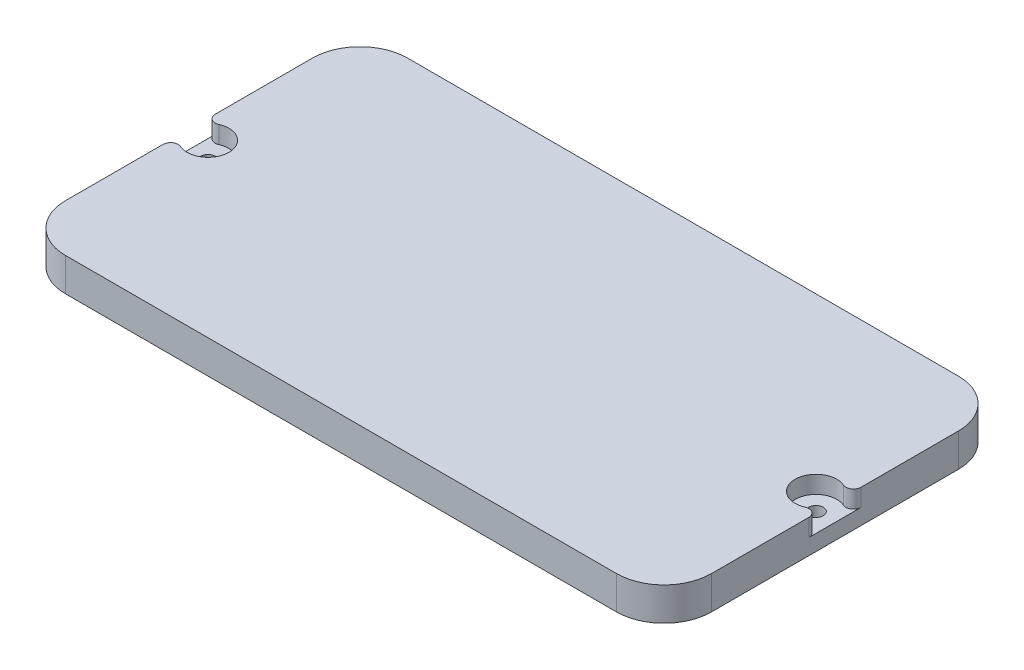
ISO-10303-21;
HEADER;
FILE_DESCRIPTION(('STEP AP214'),'2;1');
FILE_NAME('part.step','',(''),(''),'','','');
FILE_SCHEMA(('AUTOMOTIVE_DESIGN { 1 0 10303 214 1 1 1 1 }'));
ENDSEC;
DATA;
#1=APPLICATION_CONTEXT('core data for automotive mechanical design processes');
#2=APPLICATION_PROTOCOL_DEFINITION('international standard','automotive_design',2000,#1);
#3=PRODUCT_CONTEXT('',#1,'mechanical');
#4=PRODUCT('Part','Part','',(#3));
#5=PRODUCT_RELATED_PRODUCT_CATEGORY('part','',(#4));
#6=PRODUCT_DEFINITION_FORMATION('','',#4);
#7=PRODUCT_DEFINITION_CONTEXT('part definition',#1,'design');
#8=PRODUCT_DEFINITION('design','',#6,#7);
#9=PRODUCT_DEFINITION_SHAPE('','',#8);
#10=(LENGTH_UNIT() NAMED_UNIT(*) SI_UNIT(.MILLI.,.METRE.));
#11=(NAMED_UNIT(*) PLANE_ANGLE_UNIT() SI_UNIT($,.RADIAN.));
#12=(NAMED_UNIT(*) SI_UNIT($,.STERADIAN.) SOLID_ANGLE_UNIT());
#13=UNCERTAINTY_MEASURE_WITH_UNIT(LENGTH_MEASURE(1.E-05),#10,'distance_accuracy_value','');
#14=(GEOMETRIC_REPRESENTATION_CONTEXT(3) GLOBAL_UNCERTAINTY_ASSIGNED_CONTEXT((#13)) GLOBAL_UNIT_ASSIGNED_CONTEXT((#10,
#11,#12)) REPRESENTATION_CONTEXT('',''));
#15=CARTESIAN_POINT('',(0.,0.,0.));
#16=DIRECTION('',(0.,0.,1.));
#17=DIRECTION('',(1.,0.,0.));
#18=AXIS2_PLACEMENT_3D('',#15,#16,#17);
#19=CARTESIAN_POINT('',(1191.18804351422,1662.78438415699,0.));
#20=DIRECTION('',(0.,1.,0.));
#21=DIRECTION('',(0.,0.,1.));
#22=AXIS2_PLACEMENT_3D('',#19,#20,#21);
#23=CYLINDRICAL_SURFACE('',#22,2.4512763115585);
#24=CARTESIAN_POINT('',(1191.18804351422,1662.78438415699,0.));
#25=DIRECTION('',(0.,1.,0.));
#26=DIRECTION('',(0.,0.,1.));
#27=AXIS2_PLACEMENT_3D('',#24,#25,#26);
#28=CIRCLE('',#27,2.4512763115585);
#29=CARTESIAN_POINT('',(1191.18804351422,1662.78438415699,2.4512763115585));
#30=VERTEX_POINT('',#29);
#31=EDGE_CURVE('E205',#30,#30,#28,.F.);
#32=ORIENTED_EDGE('',*,*,#31,.T.);
#33=EDGE_LOOP('',(#32));
#34=FACE_BOUND('',#33,.T.);
#35=CARTESIAN_POINT('',(1191.18804351422,1668.05488415699,0.));
#36=DIRECTION('',(0.,1.,0.));
#37=DIRECTION('',(0.,0.,1.));
#38=AXIS2_PLACEMENT_3D('',#35,#36,#37);
#39=CIRCLE('',#38,2.4512763115585);
#40=CARTESIAN_POINT('',(1191.18804351422,1668.05488415699,2.45127631155851));
#41=VERTEX_POINT('',#40);
#42=EDGE_CURVE('E314',#41,#41,#39,.T.);
#43=ORIENTED_EDGE('',*,*,#42,.T.);
#44=EDGE_LOOP('',(#43));
#45=FACE_BOUND('',#44,.T.);
#46=ADVANCED_FACE('F33',(#34,#45),#23,.F.);
#47=CARTESIAN_POINT('',(1394.38804351422,1662.78438415699,-2.70566684940159E-13));
#48=DIRECTION('',(0.,1.,0.));
#49=DIRECTION('',(0.,0.,1.));
#50=AXIS2_PLACEMENT_3D('',#47,#48,#49);
#51=CYLINDRICAL_SURFACE('',#50,2.4512763115585);
#52=CARTESIAN_POINT('',(1394.38804351422,1662.78438415699,-2.70566684940159E-13));
#53=DIRECTION('',(0.,1.,0.));
#54=DIRECTION('',(0.,0.,1.));
#55=AXIS2_PLACEMENT_3D('',#52,#53,#54);
#56=CIRCLE('',#55,2.4512763115585);
#57=CARTESIAN_POINT('',(1394.38804351422,1662.78438415699,2.45127631155823));
#58=VERTEX_POINT('',#57);
#59=EDGE_CURVE('E202',#58,#58,#56,.F.);
#60=ORIENTED_EDGE('',*,*,#59,.T.);
#61=EDGE_LOOP('',(#60));
#62=FACE_BOUND('',#61,.T.);
#63=CARTESIAN_POINT('',(1394.38804351422,1668.05488415699,-2.64715254488873E-13));
#64=DIRECTION('',(0.,1.,0.));
#65=DIRECTION('',(0.,0.,1.));
#66=AXIS2_PLACEMENT_3D('',#63,#64,#65);
#67=CIRCLE('',#66,2.4512763115585);
#68=CARTESIAN_POINT('',(1394.38804351422,1668.05488415699,2.45127631155824));
#69=VERTEX_POINT('',#68);
#70=EDGE_CURVE('E208',#69,#69,#67,.T.);
#71=ORIENTED_EDGE('',*,*,#70,.T.);
#72=EDGE_LOOP('',(#71));
#73=FACE_BOUND('',#72,.T.);
#74=ADVANCED_FACE('F342',(#62,#73),#51,.F.);
#75=CARTESIAN_POINT('',(1292.78804351422,1662.78438415699,-4.51194637207664E-13));
#76=DIRECTION('',(0.,1.,0.));
#77=DIRECTION('',(0.,0.,1.));
#78=AXIS2_PLACEMENT_3D('',#75,#76,#77);
#79=PLANE('',#78);
#80=CARTESIAN_POINT('',(1200.71304351422,1662.78438415699,-41.2750000000003));
#81=DIRECTION('',(0.,1.,0.));
#82=DIRECTION('',(0.,0.,1.));
#83=AXIS2_PLACEMENT_3D('',#80,#81,#82);
#84=CIRCLE('',#83,15.875);
#85=CARTESIAN_POINT('',(1200.71304351422,1662.78438415699,-57.1500000000003));
#86=VERTEX_POINT('',#85);
#87=CARTESIAN_POINT('',(1184.83804351422,1662.78438415699,-41.2750000000003));
#88=VERTEX_POINT('',#87);
#89=EDGE_CURVE('E199',#86,#88,#84,.T.);
#90=ORIENTED_EDGE('',*,*,#89,.F.);
#91=DIRECTION('',(-1.,0.,0.));
#92=VECTOR('',#91,1.);
#93=CARTESIAN_POINT('',(1200.71304351422,1662.78438415699,-57.1500000000003));
#94=LINE('',#93,#92);
#95=CARTESIAN_POINT('',(1384.86304351422,1662.78438415699,-57.1500000000007));
#96=VERTEX_POINT('',#95);
#97=EDGE_CURVE('E278',#96,#86,#94,.T.);
#98=ORIENTED_EDGE('',*,*,#97,.F.);
#99=CARTESIAN_POINT('',(1384.86304351422,1662.78438415699,-41.2750000000005));
#100=DIRECTION('',(0.,1.,0.));
#101=DIRECTION('',(0.,0.,1.));
#102=AXIS2_PLACEMENT_3D('',#99,#100,#101);
#103=CIRCLE('',#102,15.8750000000001);
#104=CARTESIAN_POINT('',(1400.73804351422,1662.78438415699,-41.2750000000005));
#105=VERTEX_POINT('',#104);
#106=EDGE_CURVE('E163',#105,#96,#103,.T.);
#107=ORIENTED_EDGE('',*,*,#106,.F.);
#108=DIRECTION('',(0.,0.,-1.));
#109=VECTOR('',#108,1.);
#110=CARTESIAN_POINT('',(1400.73804351422,1662.78438415699,-41.2750000000005));
#111=LINE('',#110,#109);
#112=CARTESIAN_POINT('',(1400.73804351422,1662.78438415699,41.2749999999994));
#113=VERTEX_POINT('',#112);
#114=EDGE_CURVE('E160',#113,#105,#111,.T.);
#115=ORIENTED_EDGE('',*,*,#114,.F.);
#116=CARTESIAN_POINT('',(1384.86304351422,1662.78438415699,41.2749999999995));
#117=DIRECTION('',(0.,1.,0.));
#118=DIRECTION('',(0.,0.,1.));
#119=AXIS2_PLACEMENT_3D('',#116,#117,#118);
#120=CIRCLE('',#119,15.8750000000001);
#121=CARTESIAN_POINT('',(1384.86304351422,1662.78438415699,57.1499999999996));
#122=VERTEX_POINT('',#121);
#123=EDGE_CURVE('E191',#122,#113,#120,.T.);
#124=ORIENTED_EDGE('',*,*,#123,.F.);
#125=DIRECTION('',(1.,0.,0.));
#126=VECTOR('',#125,1.);
#127=CARTESIAN_POINT('',(1384.86304351422,1662.78438415699,57.1499999999996));
#128=LINE('',#127,#126);
#129=CARTESIAN_POINT('',(1200.71304351422,1662.78438415699,57.1499999999996));
#130=VERTEX_POINT('',#129);
#131=EDGE_CURVE('E271',#130,#122,#128,.T.);
#132=ORIENTED_EDGE('',*,*,#131,.F.);
#133=CARTESIAN_POINT('',(1200.71304351422,1662.78438415699,41.2749999999997));
#134=DIRECTION('',(0.,1.,0.));
#135=DIRECTION('',(0.,0.,1.));
#136=AXIS2_PLACEMENT_3D('',#133,#134,#135);
#137=CIRCLE('',#136,15.875);
#138=CARTESIAN_POINT('',(1184.83804351422,1662.78438415699,41.2749999999997));
#139=VERTEX_POINT('',#138);
#140=EDGE_CURVE('E195',#139,#130,#137,.T.);
#141=ORIENTED_EDGE('',*,*,#140,.F.);
#142=DIRECTION('',(0.,0.,1.));
#143=VECTOR('',#142,1.);
#144=CARTESIAN_POINT('',(1184.83804351422,1662.78438415699,41.2749999999997));
#145=LINE('',#144,#143);
#146=EDGE_CURVE('E176',#88,#139,#145,.T.);
#147=ORIENTED_EDGE('',*,*,#146,.F.);
#148=EDGE_LOOP('',(#90,#98,#107,#115,#124,#132,#141,#147));
#149=FACE_BOUND('',#148,.T.);
#150=ORIENTED_EDGE('',*,*,#59,.F.);
#151=EDGE_LOOP('',(#150));
#152=FACE_BOUND('',#151,.T.);
#153=ORIENTED_EDGE('',*,*,#31,.F.);
#154=EDGE_LOOP('',(#153));
#155=FACE_BOUND('',#154,.T.);
#156=ADVANCED_FACE('F285',(#149,#152,#155),#79,.F.);
#157=CARTESIAN_POINT('',(1200.71304351422,1662.78438415699,-41.2750000000003));
#158=DIRECTION('',(0.,1.,0.));
#159=DIRECTION('',(0.,0.,1.));
#160=AXIS2_PLACEMENT_3D('',#157,#158,#159);
#161=CYLINDRICAL_SURFACE('',#160,15.875);
#162=ORIENTED_EDGE('',*,*,#89,.T.);
#163=DIRECTION('',(0.,1.,0.));
#164=VECTOR('',#163,1.);
#165=CARTESIAN_POINT('',(1184.83804351422,1662.78438415699,-41.2750000000004));
#166=LINE('',#165,#164);
#167=CARTESIAN_POINT('',(1184.83804351422,1673.89688415699,-41.2750000000004));
#168=VERTEX_POINT('',#167);
#169=EDGE_CURVE('E201',#168,#88,#166,.F.);
#170=ORIENTED_EDGE('',*,*,#169,.F.);
#171=CARTESIAN_POINT('',(1200.71304351422,1673.89688415699,-41.2750000000003));
#172=DIRECTION('',(0.,1.,0.));
#173=DIRECTION('',(0.,0.,1.));
#174=AXIS2_PLACEMENT_3D('',#171,#172,#173);
#175=CIRCLE('',#174,15.875);
#176=CARTESIAN_POINT('',(1200.71304351422,1673.89688415699,-57.1500000000005));
#177=VERTEX_POINT('',#176);
#178=EDGE_CURVE('E185',#177,#168,#175,.T.);
#179=ORIENTED_EDGE('',*,*,#178,.F.);
#180=DIRECTION('',(0.,1.,0.));
#181=VECTOR('',#180,1.);
#182=CARTESIAN_POINT('',(1200.71304351422,1662.78438415699,-57.1500000000003));
#183=LINE('',#182,#181);
#184=EDGE_CURVE('E189',#86,#177,#183,.T.);
#185=ORIENTED_EDGE('',*,*,#184,.F.);
#186=EDGE_LOOP('',(#162,#170,#179,#185));
#187=FACE_BOUND('',#186,.T.);
#188=ADVANCED_FACE('F300',(#187),#161,.T.);
#189=CARTESIAN_POINT('',(1184.83804351422,1662.78438415699,41.2749999999997));
#190=DIRECTION('',(-1.,0.,0.));
#191=DIRECTION('',(0.,0.,1.));
#192=AXIS2_PLACEMENT_3D('',#189,#190,#191);
#193=PLANE('',#192);
#194=DIRECTION('',(0.,0.,1.));
#195=VECTOR('',#194,1.);
#196=CARTESIAN_POINT('',(1184.83804351422,1673.89688415699,-4.51194637207664E-13));
#197=LINE('',#196,#195);
#198=CARTESIAN_POINT('',(1184.83804351422,1673.89688415699,8.72980669889081));
#199=VERTEX_POINT('',#198);
#200=CARTESIAN_POINT('',(1184.83804351422,1673.89688415699,41.2749999999997));
#201=VERTEX_POINT('',#200);
#202=EDGE_CURVE('E188',#199,#201,#197,.T.);
#203=ORIENTED_EDGE('',*,*,#202,.F.);
#204=DIRECTION('',(0.,-1.,0.));
#205=VECTOR('',#204,1.);
#206=CARTESIAN_POINT('',(1184.83804351422,1668.05488415699,8.72980669889081));
#207=LINE('',#206,#205);
#208=CARTESIAN_POINT('',(1184.83804351422,1668.05488415699,8.72980669889081));
#209=VERTEX_POINT('',#208);
#210=EDGE_CURVE('E232',#199,#209,#207,.T.);
#211=ORIENTED_EDGE('',*,*,#210,.T.);
#212=DIRECTION('',(0.,0.,-1.));
#213=VECTOR('',#212,1.);
#214=CARTESIAN_POINT('',(1184.83804351422,1668.05488415699,41.2749999999997));
#215=LINE('',#214,#213);
#216=CARTESIAN_POINT('',(1184.83804351422,1668.05488415699,-8.72980669889078));
#217=VERTEX_POINT('',#216);
#218=EDGE_CURVE('E215',#209,#217,#215,.T.);
#219=ORIENTED_EDGE('',*,*,#218,.T.);
#220=DIRECTION('',(0.,-1.,0.));
#221=VECTOR('',#220,1.);
#222=CARTESIAN_POINT('',(1184.83804351422,1673.89688415699,-8.72980669889077));
#223=LINE('',#222,#221);
#224=CARTESIAN_POINT('',(1184.83804351422,1673.89688415699,-8.72980669889077));
#225=VERTEX_POINT('',#224);
#226=EDGE_CURVE('E230',#217,#225,#223,.F.);
#227=ORIENTED_EDGE('',*,*,#226,.T.);
#228=EDGE_CURVE('E184',#168,#225,#197,.T.);
#229=ORIENTED_EDGE('',*,*,#228,.F.);
#230=ORIENTED_EDGE('',*,*,#169,.T.);
#231=ORIENTED_EDGE('',*,*,#146,.T.);
#232=DIRECTION('',(0.,1.,0.));
#233=VECTOR('',#232,1.);
#234=CARTESIAN_POINT('',(1184.83804351422,1662.78438415699,41.2749999999997));
#235=LINE('',#234,#233);
#236=EDGE_CURVE('E198',#201,#139,#235,.F.);
#237=ORIENTED_EDGE('',*,*,#236,.F.);
#238=EDGE_LOOP('',(#203,#211,#219,#227,#229,#230,#231,#237));
#239=FACE_BOUND('',#238,.T.);
#240=ADVANCED_FACE('F303',(#239),#193,.T.);
#241=CARTESIAN_POINT('',(1200.71304351422,1662.78438415699,41.2749999999997));
#242=DIRECTION('',(0.,1.,0.));
#243=DIRECTION('',(0.,0.,1.));
#244=AXIS2_PLACEMENT_3D('',#241,#242,#243);
#245=CYLINDRICAL_SURFACE('',#244,15.875);
#246=ORIENTED_EDGE('',*,*,#140,.T.);
#247=DIRECTION('',(0.,-1.,0.));
#248=VECTOR('',#247,1.);
#249=CARTESIAN_POINT('',(1200.71304351422,1662.78438415699,57.1499999999996));
#250=LINE('',#249,#248);
#251=CARTESIAN_POINT('',(1200.71304351422,1673.89688415699,57.1499999999997));
#252=VERTEX_POINT('',#251);
#253=EDGE_CURVE('E197',#252,#130,#250,.T.);
#254=ORIENTED_EDGE('',*,*,#253,.F.);
#255=CARTESIAN_POINT('',(1200.71304351422,1673.89688415699,41.2749999999997));
#256=DIRECTION('',(0.,1.,0.));
#257=DIRECTION('',(0.,0.,1.));
#258=AXIS2_PLACEMENT_3D('',#255,#256,#257);
#259=CIRCLE('',#258,15.875);
#260=EDGE_CURVE('E181',#201,#252,#259,.T.);
#261=ORIENTED_EDGE('',*,*,#260,.F.);
#262=ORIENTED_EDGE('',*,*,#236,.T.);
#263=EDGE_LOOP('',(#246,#254,#261,#262));
#264=FACE_BOUND('',#263,.T.);
#265=ADVANCED_FACE('F309',(#264),#245,.T.);
#266=CARTESIAN_POINT('',(1384.86304351422,1662.78438415699,57.1499999999996));
#267=DIRECTION('',(0.,0.,1.));
#268=DIRECTION('',(0.,-1.,0.));
#269=AXIS2_PLACEMENT_3D('',#266,#267,#268);
#270=PLANE('',#269);
#271=ORIENTED_EDGE('',*,*,#131,.T.);
#272=DIRECTION('',(0.,1.,0.));
#273=VECTOR('',#272,1.);
#274=CARTESIAN_POINT('',(1384.86304351422,1662.78438415699,57.1499999999996));
#275=LINE('',#274,#273);
#276=CARTESIAN_POINT('',(1384.86304351422,1673.89688415699,57.1499999999997));
#277=VERTEX_POINT('',#276);
#278=EDGE_CURVE('E194',#277,#122,#275,.F.);
#279=ORIENTED_EDGE('',*,*,#278,.F.);
#280=DIRECTION('',(1.,0.,0.));
#281=VECTOR('',#280,1.);
#282=CARTESIAN_POINT('',(1292.78804351422,1673.89688415699,57.1499999999997));
#283=LINE('',#282,#281);
#284=EDGE_CURVE('E180',#252,#277,#283,.T.);
#285=ORIENTED_EDGE('',*,*,#284,.F.);
#286=ORIENTED_EDGE('',*,*,#253,.T.);
#287=EDGE_LOOP('',(#271,#279,#285,#286));
#288=FACE_BOUND('',#287,.T.);
#289=ADVANCED_FACE('F282',(#288),#270,.T.);
#290=CARTESIAN_POINT('',(1384.86304351422,1662.78438415699,41.2749999999995));
#291=DIRECTION('',(0.,1.,0.));
#292=DIRECTION('',(0.,0.,1.));
#293=AXIS2_PLACEMENT_3D('',#290,#291,#292);
#294=CYLINDRICAL_SURFACE('',#293,15.8750000000001);
#295=ORIENTED_EDGE('',*,*,#123,.T.);
#296=DIRECTION('',(0.,1.,0.));
#297=VECTOR('',#296,1.);
#298=CARTESIAN_POINT('',(1400.73804351422,1662.78438415699,41.2749999999994));
#299=LINE('',#298,#297);
#300=CARTESIAN_POINT('',(1400.73804351422,1673.89688415699,41.2749999999995));
#301=VERTEX_POINT('',#300);
#302=EDGE_CURVE('E193',#301,#113,#299,.F.);
#303=ORIENTED_EDGE('',*,*,#302,.F.);
#304=CARTESIAN_POINT('',(1384.86304351422,1673.89688415699,41.2749999999995));
#305=DIRECTION('',(0.,1.,0.));
#306=DIRECTION('',(0.,0.,1.));
#307=AXIS2_PLACEMENT_3D('',#304,#305,#306);
#308=CIRCLE('',#307,15.8750000000001);
#309=EDGE_CURVE('E153',#277,#301,#308,.T.);
#310=ORIENTED_EDGE('',*,*,#309,.F.);
#311=ORIENTED_EDGE('',*,*,#278,.T.);
#312=EDGE_LOOP('',(#295,#303,#310,#311));
#313=FACE_BOUND('',#312,.T.);
#314=ADVANCED_FACE('F264',(#313),#294,.T.);
#315=CARTESIAN_POINT('',(1400.73804351422,1662.78438415699,-41.2750000000005));
#316=DIRECTION('',(1.,0.,0.));
#317=DIRECTION('',(0.,0.,-1.));
#318=AXIS2_PLACEMENT_3D('',#315,#316,#317);
#319=PLANE('',#318);
#320=DIRECTION('',(0.,0.,1.));
#321=VECTOR('',#320,1.);
#322=CARTESIAN_POINT('',(1400.73804351422,1668.05488415699,-41.2750000000004));
#323=LINE('',#322,#321);
#324=CARTESIAN_POINT('',(1400.73804351422,1668.05488415699,-8.72980669889099));
#325=VERTEX_POINT('',#324);
#326=CARTESIAN_POINT('',(1400.73804351422,1668.05488415699,8.72980669889039));
#327=VERTEX_POINT('',#326);
#328=EDGE_CURVE('E48',#325,#327,#323,.T.);
#329=ORIENTED_EDGE('',*,*,#328,.T.);
#330=DIRECTION('',(0.,-1.,0.));
#331=VECTOR('',#330,1.);
#332=CARTESIAN_POINT('',(1400.73804351422,1673.89688415699,8.7298066988904));
#333=LINE('',#332,#331);
#334=CARTESIAN_POINT('',(1400.73804351422,1673.89688415699,8.7298066988904));
#335=VERTEX_POINT('',#334);
#336=EDGE_CURVE('E243',#327,#335,#333,.F.);
#337=ORIENTED_EDGE('',*,*,#336,.T.);
#338=DIRECTION('',(0.,0.,1.));
#339=VECTOR('',#338,1.);
#340=CARTESIAN_POINT('',(1400.73804351422,1673.89688415699,-4.51194637207664E-13));
#341=LINE('',#340,#339);
#342=EDGE_CURVE('E152',#301,#335,#341,.F.);
#343=ORIENTED_EDGE('',*,*,#342,.F.);
#344=ORIENTED_EDGE('',*,*,#302,.T.);
#345=ORIENTED_EDGE('',*,*,#114,.T.);
#346=DIRECTION('',(0.,1.,0.));
#347=VECTOR('',#346,1.);
#348=CARTESIAN_POINT('',(1400.73804351422,1662.78438415699,-41.2750000000005));
#349=LINE('',#348,#347);
#350=CARTESIAN_POINT('',(1400.73804351422,1673.89688415699,-41.2750000000005));
#351=VERTEX_POINT('',#350);
#352=EDGE_CURVE('E156',#351,#105,#349,.F.);
#353=ORIENTED_EDGE('',*,*,#352,.F.);
#354=CARTESIAN_POINT('',(1400.73804351422,1673.89688415699,-8.72980669889099));
#355=VERTEX_POINT('',#354);
#356=EDGE_CURVE('E142',#355,#351,#341,.F.);
#357=ORIENTED_EDGE('',*,*,#356,.F.);
#358=DIRECTION('',(0.,-1.,0.));
#359=VECTOR('',#358,1.);
#360=CARTESIAN_POINT('',(1400.73804351422,1668.05488415699,-8.72980669889099));
#361=LINE('',#360,#359);
#362=EDGE_CURVE('E241',#355,#325,#361,.T.);
#363=ORIENTED_EDGE('',*,*,#362,.T.);
#364=EDGE_LOOP('',(#329,#337,#343,#344,#345,#353,#357,#363));
#365=FACE_BOUND('',#364,.T.);
#366=ADVANCED_FACE('F157',(#365),#319,.T.);
#367=CARTESIAN_POINT('',(1384.86304351422,1662.78438415699,-41.2750000000005));
#368=DIRECTION('',(0.,1.,0.));
#369=DIRECTION('',(0.,0.,1.));
#370=AXIS2_PLACEMENT_3D('',#367,#368,#369);
#371=CYLINDRICAL_SURFACE('',#370,15.8750000000001);
#372=ORIENTED_EDGE('',*,*,#106,.T.);
#373=DIRECTION('',(0.,1.,0.));
#374=VECTOR('',#373,1.);
#375=CARTESIAN_POINT('',(1384.86304351422,1662.78438415699,-57.1500000000007));
#376=LINE('',#375,#374);
#377=CARTESIAN_POINT('',(1384.86304351422,1673.89688415699,-57.1500000000007));
#378=VERTEX_POINT('',#377);
#379=EDGE_CURVE('E167',#378,#96,#376,.F.);
#380=ORIENTED_EDGE('',*,*,#379,.F.);
#381=CARTESIAN_POINT('',(1384.86304351422,1673.89688415699,-41.2750000000005));
#382=DIRECTION('',(0.,1.,0.));
#383=DIRECTION('',(0.,0.,1.));
#384=AXIS2_PLACEMENT_3D('',#381,#382,#383);
#385=CIRCLE('',#384,15.8750000000001);
#386=EDGE_CURVE('E148',#351,#378,#385,.T.);
#387=ORIENTED_EDGE('',*,*,#386,.F.);
#388=ORIENTED_EDGE('',*,*,#352,.T.);
#389=EDGE_LOOP('',(#372,#380,#387,#388));
#390=FACE_BOUND('',#389,.T.);
#391=ADVANCED_FACE('F165',(#390),#371,.T.);
#392=CARTESIAN_POINT('',(1200.71304351422,1662.78438415699,-57.1500000000003));
#393=DIRECTION('',(0.,0.,-1.));
#394=DIRECTION('',(-1.,0.,0.));
#395=AXIS2_PLACEMENT_3D('',#392,#393,#394);
#396=PLANE('',#395);
#397=ORIENTED_EDGE('',*,*,#97,.T.);
#398=ORIENTED_EDGE('',*,*,#184,.T.);
#399=DIRECTION('',(1.,0.,0.));
#400=VECTOR('',#399,1.);
#401=CARTESIAN_POINT('',(1292.78804351422,1673.89688415699,-57.1500000000007));
#402=LINE('',#401,#400);
#403=EDGE_CURVE('E169',#378,#177,#402,.F.);
#404=ORIENTED_EDGE('',*,*,#403,.F.);
#405=ORIENTED_EDGE('',*,*,#379,.T.);
#406=EDGE_LOOP('',(#397,#398,#404,#405));
#407=FACE_BOUND('',#406,.T.);
#408=ADVANCED_FACE('F292',(#407),#396,.T.);
#409=CARTESIAN_POINT('',(1292.78804351422,1673.89688415699,-4.51194637207664E-13));
#410=DIRECTION('',(0.,1.,0.));
#411=DIRECTION('',(0.,0.,1.));
#412=AXIS2_PLACEMENT_3D('',#409,#410,#411);
#413=PLANE('',#412);
#414=CARTESIAN_POINT('',(1191.18804351422,1673.89688415699,0.));
#415=DIRECTION('',(0.,1.,0.));
#416=DIRECTION('',(0.,0.,1.));
#417=AXIS2_PLACEMENT_3D('',#414,#415,#416);
#418=CIRCLE('',#417,6.98499999999996);
#419=CARTESIAN_POINT('',(1188.39404351422,1673.89688415699,6.40185824585329));
#420=VERTEX_POINT('',#419);
#421=CARTESIAN_POINT('',(1188.39404351422,1673.89688415699,-6.40185824585327));
#422=VERTEX_POINT('',#421);
#423=EDGE_CURVE('E212',#420,#422,#418,.T.);
#424=ORIENTED_EDGE('',*,*,#423,.F.);
#425=CARTESIAN_POINT('',(1187.37804351422,1673.89688415699,8.72980669889081));
#426=DIRECTION('',(0.,1.,0.));
#427=DIRECTION('',(0.,0.,1.));
#428=AXIS2_PLACEMENT_3D('',#425,#426,#427);
#429=CIRCLE('',#428,2.54);
#430=EDGE_CURVE('E228',#420,#199,#429,.T.);
#431=ORIENTED_EDGE('',*,*,#430,.T.);
#432=ORIENTED_EDGE('',*,*,#202,.T.);
#433=ORIENTED_EDGE('',*,*,#260,.T.);
#434=ORIENTED_EDGE('',*,*,#284,.T.);
#435=ORIENTED_EDGE('',*,*,#309,.T.);
#436=ORIENTED_EDGE('',*,*,#342,.T.);
#437=CARTESIAN_POINT('',(1398.19804351422,1673.89688415699,8.72980669889042));
#438=DIRECTION('',(0.,1.,0.));
#439=DIRECTION('',(0.,0.,1.));
#440=AXIS2_PLACEMENT_3D('',#437,#438,#439);
#441=CIRCLE('',#440,2.54);
#442=CARTESIAN_POINT('',(1397.18204351422,1673.89688415699,6.40185824585292));
#443=VERTEX_POINT('',#442);
#444=EDGE_CURVE('E224',#335,#443,#441,.T.);
#445=ORIENTED_EDGE('',*,*,#444,.T.);
#446=CARTESIAN_POINT('',(1394.38804351422,1673.89688415699,-2.58229331579013E-13));
#447=DIRECTION('',(0.,1.,0.));
#448=DIRECTION('',(0.,0.,1.));
#449=AXIS2_PLACEMENT_3D('',#446,#447,#448);
#450=CIRCLE('',#449,6.98499999999996);
#451=CARTESIAN_POINT('',(1397.18204351422,1673.89688415699,-6.40185824585344));
#452=VERTEX_POINT('',#451);
#453=EDGE_CURVE('E171',#452,#443,#450,.T.);
#454=ORIENTED_EDGE('',*,*,#453,.F.);
#455=CARTESIAN_POINT('',(1398.19804351422,1673.89688415699,-8.72980669889097));
#456=DIRECTION('',(0.,1.,0.));
#457=DIRECTION('',(0.,0.,1.));
#458=AXIS2_PLACEMENT_3D('',#455,#456,#457);
#459=CIRCLE('',#458,2.54);
#460=EDGE_CURVE('E150',#452,#355,#459,.T.);
#461=ORIENTED_EDGE('',*,*,#460,.T.);
#462=ORIENTED_EDGE('',*,*,#356,.T.);
#463=ORIENTED_EDGE('',*,*,#386,.T.);
#464=ORIENTED_EDGE('',*,*,#403,.T.);
#465=ORIENTED_EDGE('',*,*,#178,.T.);
#466=ORIENTED_EDGE('',*,*,#228,.T.);
#467=CARTESIAN_POINT('',(1187.37804351422,1673.89688415699,-8.72980669889077));
#468=DIRECTION('',(0.,1.,0.));
#469=DIRECTION('',(0.,0.,1.));
#470=AXIS2_PLACEMENT_3D('',#467,#468,#469);
#471=CIRCLE('',#470,2.54);
#472=EDGE_CURVE('E226',#225,#422,#471,.T.);
#473=ORIENTED_EDGE('',*,*,#472,.T.);
#474=EDGE_LOOP('',(#424,#431,#432,#433,#434,#435,#436,#445,#454,#461,#462,#463,#464,#465,#466,#473));
#475=FACE_BOUND('',#474,.T.);
#476=ADVANCED_FACE('F145',(#475),#413,.T.);
#477=CARTESIAN_POINT('',(1394.38804351422,1668.05488415699,-2.64715254488873E-13));
#478=DIRECTION('',(0.,1.,0.));
#479=DIRECTION('',(0.,0.,1.));
#480=AXIS2_PLACEMENT_3D('',#477,#478,#479);
#481=CYLINDRICAL_SURFACE('',#480,6.98499999999996);
#482=ORIENTED_EDGE('',*,*,#453,.T.);
#483=DIRECTION('',(0.,1.,0.));
#484=VECTOR('',#483,1.);
#485=CARTESIAN_POINT('',(1397.18204351422,1668.05488415699,6.40185824585292));
#486=LINE('',#485,#484);
#487=CARTESIAN_POINT('',(1397.18204351422,1668.05488415699,6.40185824585292));
#488=VERTEX_POINT('',#487);
#489=EDGE_CURVE('E238',#443,#488,#486,.F.);
#490=ORIENTED_EDGE('',*,*,#489,.T.);
#491=CARTESIAN_POINT('',(1394.38804351422,1668.05488415699,-2.64715254488873E-13));
#492=DIRECTION('',(0.,1.,0.));
#493=DIRECTION('',(0.,0.,1.));
#494=AXIS2_PLACEMENT_3D('',#491,#492,#493);
#495=CIRCLE('',#494,6.98499999999996);
#496=CARTESIAN_POINT('',(1397.18204351422,1668.05488415699,-6.40185824585345));
#497=VERTEX_POINT('',#496);
#498=EDGE_CURVE('E253',#497,#488,#495,.T.);
#499=ORIENTED_EDGE('',*,*,#498,.F.);
#500=DIRECTION('',(0.,1.,0.));
#501=VECTOR('',#500,1.);
#502=CARTESIAN_POINT('',(1397.18204351422,1668.05488415699,-6.40185824585345));
#503=LINE('',#502,#501);
#504=EDGE_CURVE('E235',#497,#452,#503,.T.);
#505=ORIENTED_EDGE('',*,*,#504,.T.);
#506=EDGE_LOOP('',(#482,#490,#499,#505));
#507=FACE_BOUND('',#506,.T.);
#508=ADVANCED_FACE('F353',(#507),#481,.F.);
#509=CARTESIAN_POINT('',(1394.38804351422,1668.05488415699,-2.64715254488873E-13));
#510=DIRECTION('',(0.,1.,0.));
#511=DIRECTION('',(0.,0.,1.));
#512=AXIS2_PLACEMENT_3D('',#509,#510,#511);
#513=PLANE('',#512);
#514=ORIENTED_EDGE('',*,*,#70,.F.);
#515=EDGE_LOOP('',(#514));
#516=FACE_BOUND('',#515,.T.);
#517=ORIENTED_EDGE('',*,*,#328,.F.);
#518=CARTESIAN_POINT('',(1398.19804351422,1668.05488415699,-8.72980669889098));
#519=DIRECTION('',(0.,1.,0.));
#520=DIRECTION('',(0.,0.,1.));
#521=AXIS2_PLACEMENT_3D('',#518,#519,#520);
#522=CIRCLE('',#521,2.54);
#523=EDGE_CURVE('E11',#325,#497,#522,.F.);
#524=ORIENTED_EDGE('',*,*,#523,.T.);
#525=ORIENTED_EDGE('',*,*,#498,.T.);
#526=CARTESIAN_POINT('',(1398.19804351422,1668.05488415699,8.72980669889041));
#527=DIRECTION('',(0.,1.,0.));
#528=DIRECTION('',(0.,0.,1.));
#529=AXIS2_PLACEMENT_3D('',#526,#527,#528);
#530=CIRCLE('',#529,2.54);
#531=EDGE_CURVE('E41',#488,#327,#530,.F.);
#532=ORIENTED_EDGE('',*,*,#531,.T.);
#533=EDGE_LOOP('',(#517,#524,#525,#532));
#534=FACE_BOUND('',#533,.T.);
#535=ADVANCED_FACE('F251',(#516,#534),#513,.T.);
#536=CARTESIAN_POINT('',(1191.18804351422,1668.05488415699,0.));
#537=DIRECTION('',(0.,1.,0.));
#538=DIRECTION('',(0.,0.,1.));
#539=AXIS2_PLACEMENT_3D('',#536,#537,#538);
#540=CYLINDRICAL_SURFACE('',#539,6.98499999999996);
#541=CARTESIAN_POINT('',(1191.18804351422,1668.05488415699,0.));
#542=DIRECTION('',(0.,1.,0.));
#543=DIRECTION('',(0.,0.,1.));
#544=AXIS2_PLACEMENT_3D('',#541,#542,#543);
#545=CIRCLE('',#544,6.98499999999996);
#546=CARTESIAN_POINT('',(1188.39404351422,1668.05488415699,6.40185824585329));
#547=VERTEX_POINT('',#546);
#548=CARTESIAN_POINT('',(1188.39404351422,1668.05488415699,-6.40185824585327));
#549=VERTEX_POINT('',#548);
#550=EDGE_CURVE('E317',#547,#549,#545,.T.);
#551=ORIENTED_EDGE('',*,*,#550,.F.);
#552=DIRECTION('',(0.,1.,0.));
#553=VECTOR('',#552,1.);
#554=CARTESIAN_POINT('',(1188.39404351422,1668.05488415699,6.40185824585328));
#555=LINE('',#554,#553);
#556=EDGE_CURVE('E220',#547,#420,#555,.T.);
#557=ORIENTED_EDGE('',*,*,#556,.T.);
#558=ORIENTED_EDGE('',*,*,#423,.T.);
#559=DIRECTION('',(0.,1.,0.));
#560=VECTOR('',#559,1.);
#561=CARTESIAN_POINT('',(1188.39404351422,1668.05488415699,-6.40185824585327));
#562=LINE('',#561,#560);
#563=EDGE_CURVE('E217',#422,#549,#562,.F.);
#564=ORIENTED_EDGE('',*,*,#563,.T.);
#565=EDGE_LOOP('',(#551,#557,#558,#564));
#566=FACE_BOUND('',#565,.T.);
#567=ADVANCED_FACE('F325',(#566),#540,.F.);
#568=CARTESIAN_POINT('',(1191.18804351422,1668.05488415699,0.));
#569=DIRECTION('',(0.,1.,0.));
#570=DIRECTION('',(0.,0.,1.));
#571=AXIS2_PLACEMENT_3D('',#568,#569,#570);
#572=PLANE('',#571);
#573=ORIENTED_EDGE('',*,*,#42,.F.);
#574=EDGE_LOOP('',(#573));
#575=FACE_BOUND('',#574,.T.);
#576=ORIENTED_EDGE('',*,*,#218,.F.);
#577=CARTESIAN_POINT('',(1187.37804351422,1668.05488415699,8.7298066988908));
#578=DIRECTION('',(0.,1.,0.));
#579=DIRECTION('',(0.,0.,1.));
#580=AXIS2_PLACEMENT_3D('',#577,#578,#579);
#581=CIRCLE('',#580,2.54);
#582=EDGE_CURVE('E245',#209,#547,#581,.F.);
#583=ORIENTED_EDGE('',*,*,#582,.T.);
#584=ORIENTED_EDGE('',*,*,#550,.T.);
#585=CARTESIAN_POINT('',(1187.37804351422,1668.05488415699,-8.72980669889078));
#586=DIRECTION('',(0.,1.,0.));
#587=DIRECTION('',(0.,0.,1.));
#588=AXIS2_PLACEMENT_3D('',#585,#586,#587);
#589=CIRCLE('',#588,2.54);
#590=EDGE_CURVE('E247',#549,#217,#589,.F.);
#591=ORIENTED_EDGE('',*,*,#590,.T.);
#592=EDGE_LOOP('',(#576,#583,#584,#591));
#593=FACE_BOUND('',#592,.T.);
#594=ADVANCED_FACE('F321',(#575,#593),#572,.T.);
#595=CARTESIAN_POINT('',(1187.37804351422,1668.05488415699,8.7298066988908));
#596=DIRECTION('',(0.,1.,0.));
#597=DIRECTION('',(0.,0.,1.));
#598=AXIS2_PLACEMENT_3D('',#595,#596,#597);
#599=CYLINDRICAL_SURFACE('',#598,2.54);
#600=ORIENTED_EDGE('',*,*,#582,.F.);
#601=ORIENTED_EDGE('',*,*,#210,.F.);
#602=ORIENTED_EDGE('',*,*,#430,.F.);
#603=ORIENTED_EDGE('',*,*,#556,.F.);
#604=EDGE_LOOP('',(#600,#601,#602,#603));
#605=FACE_BOUND('',#604,.T.);
#606=ADVANCED_FACE('F328',(#605),#599,.T.);
#607=CARTESIAN_POINT('',(1187.37804351422,1668.05488415699,-8.72980669889078));
#608=DIRECTION('',(0.,1.,0.));
#609=DIRECTION('',(0.,0.,1.));
#610=AXIS2_PLACEMENT_3D('',#607,#608,#609);
#611=CYLINDRICAL_SURFACE('',#610,2.54);
#612=ORIENTED_EDGE('',*,*,#472,.F.);
#613=ORIENTED_EDGE('',*,*,#226,.F.);
#614=ORIENTED_EDGE('',*,*,#590,.F.);
#615=ORIENTED_EDGE('',*,*,#563,.F.);
#616=EDGE_LOOP('',(#612,#613,#614,#615));
#617=FACE_BOUND('',#616,.T.);
#618=ADVANCED_FACE('F330',(#617),#611,.T.);
#619=CARTESIAN_POINT('',(1398.19804351422,1668.05488415699,8.72980669889041));
#620=DIRECTION('',(0.,1.,0.));
#621=DIRECTION('',(0.,0.,1.));
#622=AXIS2_PLACEMENT_3D('',#619,#620,#621);
#623=CYLINDRICAL_SURFACE('',#622,2.54);
#624=ORIENTED_EDGE('',*,*,#444,.F.);
#625=ORIENTED_EDGE('',*,*,#336,.F.);
#626=ORIENTED_EDGE('',*,*,#531,.F.);
#627=ORIENTED_EDGE('',*,*,#489,.F.);
#628=EDGE_LOOP('',(#624,#625,#626,#627));
#629=FACE_BOUND('',#628,.T.);
#630=ADVANCED_FACE('F257',(#629),#623,.T.);
#631=CARTESIAN_POINT('',(1398.19804351422,1668.05488415699,-8.72980669889098));
#632=DIRECTION('',(0.,1.,0.));
#633=DIRECTION('',(0.,0.,1.));
#634=AXIS2_PLACEMENT_3D('',#631,#632,#633);
#635=CYLINDRICAL_SURFACE('',#634,2.54);
#636=ORIENTED_EDGE('',*,*,#523,.F.);
#637=ORIENTED_EDGE('',*,*,#362,.F.);
#638=ORIENTED_EDGE('',*,*,#460,.F.);
#639=ORIENTED_EDGE('',*,*,#504,.F.);
#640=EDGE_LOOP('',(#636,#637,#638,#639));
#641=FACE_BOUND('',#640,.T.);
#642=ADVANCED_FACE('F35',(#641),#635,.T.);
#643=CLOSED_SHELL('',(#46,#74,#156,#188,#240,#265,#289,#314,#366,#391,#408,#476,#508,#535,#567,
#594,#606,#618,#630,#642));
#644=MANIFOLD_SOLID_BREP('B2',#643);
#645=ADVANCED_BREP_SHAPE_REPRESENTATION('',(#18,#644),#14);
#646=SHAPE_DEFINITION_REPRESENTATION(#9,#645);
ENDSEC;
END-ISO-10303-21;
